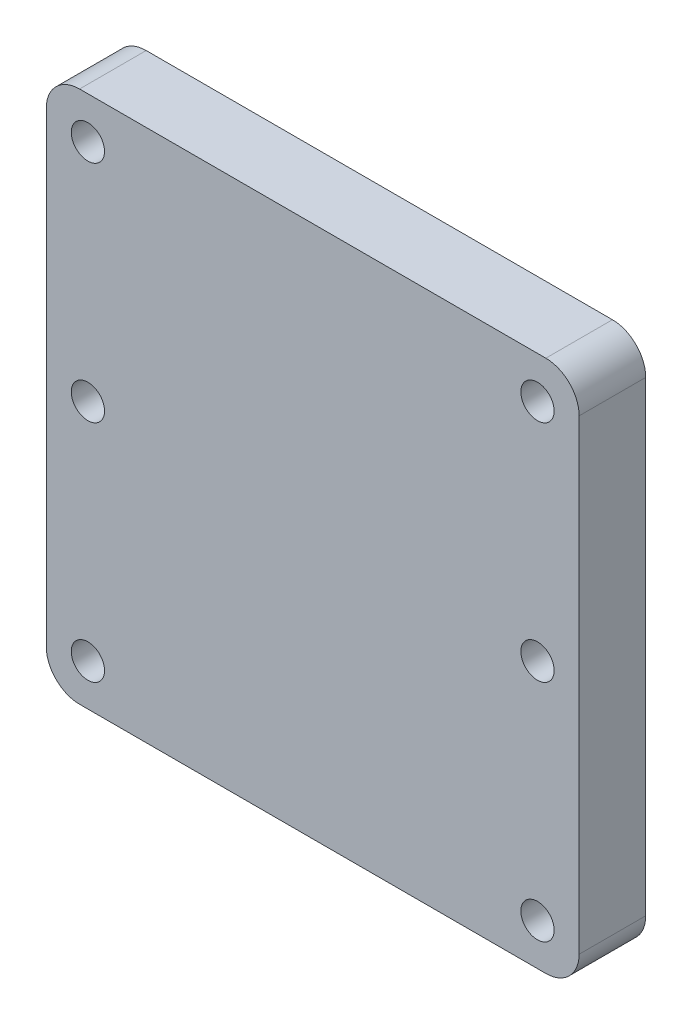
ISO-10303-21;
HEADER;
FILE_DESCRIPTION(('STEP AP214'),'2;1');
FILE_NAME('part.step','',(''),(''),'','','');
FILE_SCHEMA(('AUTOMOTIVE_DESIGN { 1 0 10303 214 1 1 1 1 }'));
ENDSEC;
DATA;
#1=APPLICATION_CONTEXT('core data for automotive mechanical design processes');
#2=APPLICATION_PROTOCOL_DEFINITION('international standard','automotive_design',2000,#1);
#3=PRODUCT_CONTEXT('',#1,'mechanical');
#4=PRODUCT('Part','Part','',(#3));
#5=PRODUCT_RELATED_PRODUCT_CATEGORY('part','',(#4));
#6=PRODUCT_DEFINITION_FORMATION('','',#4);
#7=PRODUCT_DEFINITION_CONTEXT('part definition',#1,'design');
#8=PRODUCT_DEFINITION('design','',#6,#7);
#9=PRODUCT_DEFINITION_SHAPE('','',#8);
#10=(LENGTH_UNIT() NAMED_UNIT(*) SI_UNIT(.MILLI.,.METRE.));
#11=(NAMED_UNIT(*) PLANE_ANGLE_UNIT() SI_UNIT($,.RADIAN.));
#12=(NAMED_UNIT(*) SI_UNIT($,.STERADIAN.) SOLID_ANGLE_UNIT());
#13=UNCERTAINTY_MEASURE_WITH_UNIT(LENGTH_MEASURE(1.E-05),#10,'distance_accuracy_value','');
#14=(GEOMETRIC_REPRESENTATION_CONTEXT(3) GLOBAL_UNCERTAINTY_ASSIGNED_CONTEXT((#13)) GLOBAL_UNIT_ASSIGNED_CONTEXT((#10,
#11,#12)) REPRESENTATION_CONTEXT('',''));
#15=CARTESIAN_POINT('',(0.,0.,0.));
#16=DIRECTION('',(0.,0.,1.));
#17=DIRECTION('',(1.,0.,0.));
#18=AXIS2_PLACEMENT_3D('',#15,#16,#17);
#19=CARTESIAN_POINT('',(-44.45,-44.45,12.7));
#20=DIRECTION('',(0.,0.,-1.));
#21=DIRECTION('',(-1.,0.,0.));
#22=AXIS2_PLACEMENT_3D('',#19,#20,#21);
#23=PLANE('',#22);
#24=CARTESIAN_POINT('',(-44.45,-44.45,12.7));
#25=DIRECTION('',(0.,0.,1.));
#26=DIRECTION('',(-1.,0.,0.));
#27=AXIS2_PLACEMENT_3D('',#24,#25,#26);
#28=CIRCLE('',#27,6.35);
#29=CARTESIAN_POINT('',(-50.8,-44.45,12.7));
#30=VERTEX_POINT('',#29);
#31=CARTESIAN_POINT('',(-44.4499999999999,-50.8,12.7));
#32=VERTEX_POINT('',#31);
#33=EDGE_CURVE('E150',#30,#32,#28,.T.);
#34=ORIENTED_EDGE('',*,*,#33,.T.);
#35=DIRECTION('',(1.,0.,0.));
#36=VECTOR('',#35,1.);
#37=CARTESIAN_POINT('',(44.45,-50.8,12.7));
#38=LINE('',#37,#36);
#39=CARTESIAN_POINT('',(44.45,-50.8,12.7));
#40=VERTEX_POINT('',#39);
#41=EDGE_CURVE('E98',#32,#40,#38,.T.);
#42=ORIENTED_EDGE('',*,*,#41,.T.);
#43=CARTESIAN_POINT('',(44.45,-44.45,12.7));
#44=DIRECTION('',(0.,0.,1.));
#45=DIRECTION('',(1.,0.,0.));
#46=AXIS2_PLACEMENT_3D('',#43,#44,#45);
#47=CIRCLE('',#46,6.35);
#48=CARTESIAN_POINT('',(50.8,-44.45,12.7));
#49=VERTEX_POINT('',#48);
#50=EDGE_CURVE('E165',#40,#49,#47,.T.);
#51=ORIENTED_EDGE('',*,*,#50,.T.);
#52=DIRECTION('',(0.,1.,0.));
#53=VECTOR('',#52,1.);
#54=CARTESIAN_POINT('',(50.8,-44.45,12.7));
#55=LINE('',#54,#53);
#56=CARTESIAN_POINT('',(50.8,44.45,12.7));
#57=VERTEX_POINT('',#56);
#58=EDGE_CURVE('E178',#49,#57,#55,.T.);
#59=ORIENTED_EDGE('',*,*,#58,.T.);
#60=CARTESIAN_POINT('',(44.45,44.45,12.7));
#61=DIRECTION('',(0.,0.,1.));
#62=DIRECTION('',(1.,0.,0.));
#63=AXIS2_PLACEMENT_3D('',#60,#61,#62);
#64=CIRCLE('',#63,6.35);
#65=CARTESIAN_POINT('',(44.45,50.8,12.7));
#66=VERTEX_POINT('',#65);
#67=EDGE_CURVE('E117',#57,#66,#64,.T.);
#68=ORIENTED_EDGE('',*,*,#67,.T.);
#69=DIRECTION('',(-1.,0.,0.));
#70=VECTOR('',#69,1.);
#71=CARTESIAN_POINT('',(44.45,50.8,12.7));
#72=LINE('',#71,#70);
#73=CARTESIAN_POINT('',(-44.4499999999999,50.8,12.7));
#74=VERTEX_POINT('',#73);
#75=EDGE_CURVE('E111',#66,#74,#72,.T.);
#76=ORIENTED_EDGE('',*,*,#75,.T.);
#77=CARTESIAN_POINT('',(-44.45,44.45,12.7));
#78=DIRECTION('',(0.,0.,1.));
#79=DIRECTION('',(1.,0.,0.));
#80=AXIS2_PLACEMENT_3D('',#77,#78,#79);
#81=CIRCLE('',#80,6.35);
#82=CARTESIAN_POINT('',(-50.8,44.45,12.7));
#83=VERTEX_POINT('',#82);
#84=EDGE_CURVE('E115',#74,#83,#81,.T.);
#85=ORIENTED_EDGE('',*,*,#84,.T.);
#86=DIRECTION('',(0.,-1.,0.));
#87=VECTOR('',#86,1.);
#88=CARTESIAN_POINT('',(-50.8,-44.45,12.7));
#89=LINE('',#88,#87);
#90=EDGE_CURVE('E55',#83,#30,#89,.T.);
#91=ORIENTED_EDGE('',*,*,#90,.T.);
#92=EDGE_LOOP('',(#34,#42,#51,#59,#68,#76,#85,#91));
#93=FACE_BOUND('',#92,.T.);
#94=CARTESIAN_POINT('',(-42.8625,42.8625,12.7));
#95=DIRECTION('',(0.,0.,1.));
#96=DIRECTION('',(1.,0.,0.));
#97=AXIS2_PLACEMENT_3D('',#94,#95,#96);
#98=CIRCLE('',#97,3.175);
#99=CARTESIAN_POINT('',(-39.6875,42.8625,12.7));
#100=VERTEX_POINT('',#99);
#101=EDGE_CURVE('E139',#100,#100,#98,.T.);
#102=ORIENTED_EDGE('',*,*,#101,.F.);
#103=EDGE_LOOP('',(#102));
#104=FACE_BOUND('',#103,.T.);
#105=CARTESIAN_POINT('',(42.8625,42.8625,12.7));
#106=DIRECTION('',(0.,0.,1.));
#107=DIRECTION('',(1.,0.,0.));
#108=AXIS2_PLACEMENT_3D('',#105,#106,#107);
#109=CIRCLE('',#108,3.17499999999997);
#110=CARTESIAN_POINT('',(46.0374999999999,42.8625,12.7));
#111=VERTEX_POINT('',#110);
#112=EDGE_CURVE('E187',#111,#111,#109,.T.);
#113=ORIENTED_EDGE('',*,*,#112,.F.);
#114=EDGE_LOOP('',(#113));
#115=FACE_BOUND('',#114,.T.);
#116=CARTESIAN_POINT('',(42.8625,-42.8625,12.7));
#117=DIRECTION('',(0.,0.,1.));
#118=DIRECTION('',(1.,0.,0.));
#119=AXIS2_PLACEMENT_3D('',#116,#117,#118);
#120=CIRCLE('',#119,3.175);
#121=CARTESIAN_POINT('',(46.0375,-42.8625,12.7));
#122=VERTEX_POINT('',#121);
#123=EDGE_CURVE('E193',#122,#122,#120,.T.);
#124=ORIENTED_EDGE('',*,*,#123,.F.);
#125=EDGE_LOOP('',(#124));
#126=FACE_BOUND('',#125,.T.);
#127=CARTESIAN_POINT('',(-42.8625,-42.8625,12.7));
#128=DIRECTION('',(0.,0.,1.));
#129=DIRECTION('',(1.,0.,0.));
#130=AXIS2_PLACEMENT_3D('',#127,#128,#129);
#131=CIRCLE('',#130,3.175);
#132=CARTESIAN_POINT('',(-39.6875,-42.8625,12.7));
#133=VERTEX_POINT('',#132);
#134=EDGE_CURVE('E199',#133,#133,#131,.T.);
#135=ORIENTED_EDGE('',*,*,#134,.F.);
#136=EDGE_LOOP('',(#135));
#137=FACE_BOUND('',#136,.T.);
#138=CARTESIAN_POINT('',(-42.8625,0.,12.7));
#139=DIRECTION('',(0.,0.,1.));
#140=DIRECTION('',(1.,0.,0.));
#141=AXIS2_PLACEMENT_3D('',#138,#139,#140);
#142=CIRCLE('',#141,3.175);
#143=CARTESIAN_POINT('',(-39.6875,0.,12.7));
#144=VERTEX_POINT('',#143);
#145=EDGE_CURVE('E205',#144,#144,#142,.T.);
#146=ORIENTED_EDGE('',*,*,#145,.F.);
#147=EDGE_LOOP('',(#146));
#148=FACE_BOUND('',#147,.T.);
#149=CARTESIAN_POINT('',(42.8625,0.,12.7));
#150=DIRECTION('',(0.,0.,1.));
#151=DIRECTION('',(1.,0.,0.));
#152=AXIS2_PLACEMENT_3D('',#149,#150,#151);
#153=CIRCLE('',#152,3.175);
#154=CARTESIAN_POINT('',(46.0375,0.,12.7));
#155=VERTEX_POINT('',#154);
#156=EDGE_CURVE('E211',#155,#155,#153,.T.);
#157=ORIENTED_EDGE('',*,*,#156,.F.);
#158=EDGE_LOOP('',(#157));
#159=FACE_BOUND('',#158,.T.);
#160=ADVANCED_FACE('F38',(#93,#104,#115,#126,#137,#148,#159),#23,.F.);
#161=CARTESIAN_POINT('',(-44.45,-44.45,0.));
#162=DIRECTION('',(0.,0.,-1.));
#163=DIRECTION('',(-1.,0.,0.));
#164=AXIS2_PLACEMENT_3D('',#161,#162,#163);
#165=PLANE('',#164);
#166=CARTESIAN_POINT('',(-42.8625,0.,0.));
#167=DIRECTION('',(0.,0.,1.));
#168=DIRECTION('',(1.,0.,0.));
#169=AXIS2_PLACEMENT_3D('',#166,#167,#168);
#170=CIRCLE('',#169,3.175);
#171=CARTESIAN_POINT('',(-39.6875,0.,0.));
#172=VERTEX_POINT('',#171);
#173=EDGE_CURVE('E208',#172,#172,#170,.T.);
#174=ORIENTED_EDGE('',*,*,#173,.T.);
#175=EDGE_LOOP('',(#174));
#176=FACE_BOUND('',#175,.T.);
#177=CARTESIAN_POINT('',(42.8625,-42.8625,0.));
#178=DIRECTION('',(0.,0.,1.));
#179=DIRECTION('',(1.,0.,0.));
#180=AXIS2_PLACEMENT_3D('',#177,#178,#179);
#181=CIRCLE('',#180,3.175);
#182=CARTESIAN_POINT('',(46.0375,-42.8625,0.));
#183=VERTEX_POINT('',#182);
#184=EDGE_CURVE('E196',#183,#183,#181,.T.);
#185=ORIENTED_EDGE('',*,*,#184,.T.);
#186=EDGE_LOOP('',(#185));
#187=FACE_BOUND('',#186,.T.);
#188=CARTESIAN_POINT('',(-42.8625,42.8625,0.));
#189=DIRECTION('',(0.,0.,1.));
#190=DIRECTION('',(1.,0.,0.));
#191=AXIS2_PLACEMENT_3D('',#188,#189,#190);
#192=CIRCLE('',#191,3.175);
#193=CARTESIAN_POINT('',(-39.6875,42.8625,0.));
#194=VERTEX_POINT('',#193);
#195=EDGE_CURVE('E184',#194,#194,#192,.T.);
#196=ORIENTED_EDGE('',*,*,#195,.T.);
#197=EDGE_LOOP('',(#196));
#198=FACE_BOUND('',#197,.T.);
#199=CARTESIAN_POINT('',(-44.45,-44.45,0.));
#200=DIRECTION('',(0.,0.,1.));
#201=DIRECTION('',(-1.,0.,0.));
#202=AXIS2_PLACEMENT_3D('',#199,#200,#201);
#203=CIRCLE('',#202,6.35);
#204=CARTESIAN_POINT('',(-50.8,-44.45,0.));
#205=VERTEX_POINT('',#204);
#206=CARTESIAN_POINT('',(-44.4499999999999,-50.8,0.));
#207=VERTEX_POINT('',#206);
#208=EDGE_CURVE('E135',#205,#207,#203,.T.);
#209=ORIENTED_EDGE('',*,*,#208,.F.);
#210=DIRECTION('',(0.,-1.,0.));
#211=VECTOR('',#210,1.);
#212=CARTESIAN_POINT('',(-50.8,-44.45,0.));
#213=LINE('',#212,#211);
#214=CARTESIAN_POINT('',(-50.8,44.45,0.));
#215=VERTEX_POINT('',#214);
#216=EDGE_CURVE('E90',#215,#205,#213,.T.);
#217=ORIENTED_EDGE('',*,*,#216,.F.);
#218=CARTESIAN_POINT('',(-44.45,44.45,0.));
#219=DIRECTION('',(0.,0.,1.));
#220=DIRECTION('',(1.,0.,0.));
#221=AXIS2_PLACEMENT_3D('',#218,#219,#220);
#222=CIRCLE('',#221,6.35);
#223=CARTESIAN_POINT('',(-44.4499999999999,50.8,0.));
#224=VERTEX_POINT('',#223);
#225=EDGE_CURVE('E84',#224,#215,#222,.T.);
#226=ORIENTED_EDGE('',*,*,#225,.F.);
#227=DIRECTION('',(-1.,0.,0.));
#228=VECTOR('',#227,1.);
#229=CARTESIAN_POINT('',(44.45,50.8,0.));
#230=LINE('',#229,#228);
#231=CARTESIAN_POINT('',(44.45,50.8,0.));
#232=VERTEX_POINT('',#231);
#233=EDGE_CURVE('E125',#232,#224,#230,.T.);
#234=ORIENTED_EDGE('',*,*,#233,.F.);
#235=CARTESIAN_POINT('',(44.45,44.45,0.));
#236=DIRECTION('',(0.,0.,1.));
#237=DIRECTION('',(1.,0.,0.));
#238=AXIS2_PLACEMENT_3D('',#235,#236,#237);
#239=CIRCLE('',#238,6.35);
#240=CARTESIAN_POINT('',(50.8,44.45,0.));
#241=VERTEX_POINT('',#240);
#242=EDGE_CURVE('E145',#241,#232,#239,.T.);
#243=ORIENTED_EDGE('',*,*,#242,.F.);
#244=DIRECTION('',(0.,1.,0.));
#245=VECTOR('',#244,1.);
#246=CARTESIAN_POINT('',(50.8,-44.45,0.));
#247=LINE('',#246,#245);
#248=CARTESIAN_POINT('',(50.8,-44.45,0.));
#249=VERTEX_POINT('',#248);
#250=EDGE_CURVE('E143',#249,#241,#247,.T.);
#251=ORIENTED_EDGE('',*,*,#250,.F.);
#252=CARTESIAN_POINT('',(44.45,-44.45,0.));
#253=DIRECTION('',(0.,0.,1.));
#254=DIRECTION('',(1.,0.,0.));
#255=AXIS2_PLACEMENT_3D('',#252,#253,#254);
#256=CIRCLE('',#255,6.35);
#257=CARTESIAN_POINT('',(44.45,-50.8,0.));
#258=VERTEX_POINT('',#257);
#259=EDGE_CURVE('E141',#258,#249,#256,.T.);
#260=ORIENTED_EDGE('',*,*,#259,.F.);
#261=DIRECTION('',(1.,0.,0.));
#262=VECTOR('',#261,1.);
#263=CARTESIAN_POINT('',(44.45,-50.8,0.));
#264=LINE('',#263,#262);
#265=EDGE_CURVE('E138',#207,#258,#264,.T.);
#266=ORIENTED_EDGE('',*,*,#265,.F.);
#267=EDGE_LOOP('',(#209,#217,#226,#234,#243,#251,#260,#266));
#268=FACE_BOUND('',#267,.T.);
#269=CARTESIAN_POINT('',(42.8625,42.8625,0.));
#270=DIRECTION('',(0.,0.,1.));
#271=DIRECTION('',(1.,0.,0.));
#272=AXIS2_PLACEMENT_3D('',#269,#270,#271);
#273=CIRCLE('',#272,3.17499999999997);
#274=CARTESIAN_POINT('',(46.0374999999999,42.8625,0.));
#275=VERTEX_POINT('',#274);
#276=EDGE_CURVE('E190',#275,#275,#273,.T.);
#277=ORIENTED_EDGE('',*,*,#276,.T.);
#278=EDGE_LOOP('',(#277));
#279=FACE_BOUND('',#278,.T.);
#280=CARTESIAN_POINT('',(-42.8625,-42.8625,0.));
#281=DIRECTION('',(0.,0.,1.));
#282=DIRECTION('',(1.,0.,0.));
#283=AXIS2_PLACEMENT_3D('',#280,#281,#282);
#284=CIRCLE('',#283,3.175);
#285=CARTESIAN_POINT('',(-39.6875,-42.8625,0.));
#286=VERTEX_POINT('',#285);
#287=EDGE_CURVE('E202',#286,#286,#284,.T.);
#288=ORIENTED_EDGE('',*,*,#287,.T.);
#289=EDGE_LOOP('',(#288));
#290=FACE_BOUND('',#289,.T.);
#291=CARTESIAN_POINT('',(42.8625,0.,0.));
#292=DIRECTION('',(0.,0.,1.));
#293=DIRECTION('',(1.,0.,0.));
#294=AXIS2_PLACEMENT_3D('',#291,#292,#293);
#295=CIRCLE('',#294,3.175);
#296=CARTESIAN_POINT('',(46.0375,0.,0.));
#297=VERTEX_POINT('',#296);
#298=EDGE_CURVE('E214',#297,#297,#295,.T.);
#299=ORIENTED_EDGE('',*,*,#298,.T.);
#300=EDGE_LOOP('',(#299));
#301=FACE_BOUND('',#300,.T.);
#302=ADVANCED_FACE('F169',(#176,#187,#198,#268,#279,#290,#301),#165,.T.);
#303=CARTESIAN_POINT('',(-44.45,-44.45,12.7));
#304=DIRECTION('',(0.,0.,-1.));
#305=DIRECTION('',(-1.,0.,0.));
#306=AXIS2_PLACEMENT_3D('',#303,#304,#305);
#307=CYLINDRICAL_SURFACE('',#306,6.35);
#308=ORIENTED_EDGE('',*,*,#208,.T.);
#309=DIRECTION('',(0.,0.,-1.));
#310=VECTOR('',#309,1.);
#311=CARTESIAN_POINT('',(-44.4499999999999,-50.8,12.7));
#312=LINE('',#311,#310);
#313=EDGE_CURVE('E11',#32,#207,#312,.T.);
#314=ORIENTED_EDGE('',*,*,#313,.F.);
#315=ORIENTED_EDGE('',*,*,#33,.F.);
#316=DIRECTION('',(0.,0.,-1.));
#317=VECTOR('',#316,1.);
#318=CARTESIAN_POINT('',(-50.8,-44.45,12.7));
#319=LINE('',#318,#317);
#320=EDGE_CURVE('E131',#30,#205,#319,.T.);
#321=ORIENTED_EDGE('',*,*,#320,.T.);
#322=EDGE_LOOP('',(#308,#314,#315,#321));
#323=FACE_BOUND('',#322,.T.);
#324=ADVANCED_FACE('F40',(#323),#307,.T.);
#325=CARTESIAN_POINT('',(44.45,-50.8,12.7));
#326=DIRECTION('',(0.,1.,0.));
#327=DIRECTION('',(0.,0.,1.));
#328=AXIS2_PLACEMENT_3D('',#325,#326,#327);
#329=PLANE('',#328);
#330=ORIENTED_EDGE('',*,*,#265,.T.);
#331=DIRECTION('',(0.,0.,-1.));
#332=VECTOR('',#331,1.);
#333=CARTESIAN_POINT('',(44.45,-50.8,12.7));
#334=LINE('',#333,#332);
#335=EDGE_CURVE('E47',#40,#258,#334,.T.);
#336=ORIENTED_EDGE('',*,*,#335,.F.);
#337=ORIENTED_EDGE('',*,*,#41,.F.);
#338=ORIENTED_EDGE('',*,*,#313,.T.);
#339=EDGE_LOOP('',(#330,#336,#337,#338));
#340=FACE_BOUND('',#339,.T.);
#341=ADVANCED_FACE('F246',(#340),#329,.F.);
#342=CARTESIAN_POINT('',(44.45,-44.45,12.7));
#343=DIRECTION('',(0.,0.,-1.));
#344=DIRECTION('',(-1.,0.,0.));
#345=AXIS2_PLACEMENT_3D('',#342,#343,#344);
#346=CYLINDRICAL_SURFACE('',#345,6.35);
#347=ORIENTED_EDGE('',*,*,#259,.T.);
#348=DIRECTION('',(0.,0.,-1.));
#349=VECTOR('',#348,1.);
#350=CARTESIAN_POINT('',(50.8,-44.45,12.7));
#351=LINE('',#350,#349);
#352=EDGE_CURVE('E157',#49,#249,#351,.T.);
#353=ORIENTED_EDGE('',*,*,#352,.F.);
#354=ORIENTED_EDGE('',*,*,#50,.F.);
#355=ORIENTED_EDGE('',*,*,#335,.T.);
#356=EDGE_LOOP('',(#347,#353,#354,#355));
#357=FACE_BOUND('',#356,.T.);
#358=ADVANCED_FACE('F163',(#357),#346,.T.);
#359=CARTESIAN_POINT('',(50.8,-44.45,12.7));
#360=DIRECTION('',(-1.,0.,0.));
#361=DIRECTION('',(0.,0.,1.));
#362=AXIS2_PLACEMENT_3D('',#359,#360,#361);
#363=PLANE('',#362);
#364=ORIENTED_EDGE('',*,*,#250,.T.);
#365=DIRECTION('',(0.,0.,-1.));
#366=VECTOR('',#365,1.);
#367=CARTESIAN_POINT('',(50.8,44.45,12.7));
#368=LINE('',#367,#366);
#369=EDGE_CURVE('E154',#57,#241,#368,.T.);
#370=ORIENTED_EDGE('',*,*,#369,.F.);
#371=ORIENTED_EDGE('',*,*,#58,.F.);
#372=ORIENTED_EDGE('',*,*,#352,.T.);
#373=EDGE_LOOP('',(#364,#370,#371,#372));
#374=FACE_BOUND('',#373,.T.);
#375=ADVANCED_FACE('F174',(#374),#363,.F.);
#376=CARTESIAN_POINT('',(44.45,44.45,12.7));
#377=DIRECTION('',(0.,0.,-1.));
#378=DIRECTION('',(-1.,0.,0.));
#379=AXIS2_PLACEMENT_3D('',#376,#377,#378);
#380=CYLINDRICAL_SURFACE('',#379,6.35);
#381=ORIENTED_EDGE('',*,*,#242,.T.);
#382=DIRECTION('',(0.,0.,-1.));
#383=VECTOR('',#382,1.);
#384=CARTESIAN_POINT('',(44.45,50.8,12.7));
#385=LINE('',#384,#383);
#386=EDGE_CURVE('E126',#66,#232,#385,.T.);
#387=ORIENTED_EDGE('',*,*,#386,.F.);
#388=ORIENTED_EDGE('',*,*,#67,.F.);
#389=ORIENTED_EDGE('',*,*,#369,.T.);
#390=EDGE_LOOP('',(#381,#387,#388,#389));
#391=FACE_BOUND('',#390,.T.);
#392=ADVANCED_FACE('F177',(#391),#380,.T.);
#393=CARTESIAN_POINT('',(44.45,50.8,12.7));
#394=DIRECTION('',(0.,-1.,0.));
#395=DIRECTION('',(0.,0.,-1.));
#396=AXIS2_PLACEMENT_3D('',#393,#394,#395);
#397=PLANE('',#396);
#398=ORIENTED_EDGE('',*,*,#233,.T.);
#399=DIRECTION('',(0.,0.,-1.));
#400=VECTOR('',#399,1.);
#401=CARTESIAN_POINT('',(-44.4499999999999,50.8,12.7));
#402=LINE('',#401,#400);
#403=EDGE_CURVE('E122',#74,#224,#402,.T.);
#404=ORIENTED_EDGE('',*,*,#403,.F.);
#405=ORIENTED_EDGE('',*,*,#75,.F.);
#406=ORIENTED_EDGE('',*,*,#386,.T.);
#407=EDGE_LOOP('',(#398,#404,#405,#406));
#408=FACE_BOUND('',#407,.T.);
#409=ADVANCED_FACE('F123',(#408),#397,.F.);
#410=CARTESIAN_POINT('',(-44.45,44.45,12.7));
#411=DIRECTION('',(0.,0.,-1.));
#412=DIRECTION('',(-1.,0.,0.));
#413=AXIS2_PLACEMENT_3D('',#410,#411,#412);
#414=CYLINDRICAL_SURFACE('',#413,6.35);
#415=ORIENTED_EDGE('',*,*,#225,.T.);
#416=DIRECTION('',(0.,0.,-1.));
#417=VECTOR('',#416,1.);
#418=CARTESIAN_POINT('',(-50.8,44.45,12.7));
#419=LINE('',#418,#417);
#420=EDGE_CURVE('E127',#83,#215,#419,.T.);
#421=ORIENTED_EDGE('',*,*,#420,.F.);
#422=ORIENTED_EDGE('',*,*,#84,.F.);
#423=ORIENTED_EDGE('',*,*,#403,.T.);
#424=EDGE_LOOP('',(#415,#421,#422,#423));
#425=FACE_BOUND('',#424,.T.);
#426=ADVANCED_FACE('F129',(#425),#414,.T.);
#427=CARTESIAN_POINT('',(-50.8,-44.45,12.7));
#428=DIRECTION('',(1.,0.,0.));
#429=DIRECTION('',(0.,0.,-1.));
#430=AXIS2_PLACEMENT_3D('',#427,#428,#429);
#431=PLANE('',#430);
#432=ORIENTED_EDGE('',*,*,#216,.T.);
#433=ORIENTED_EDGE('',*,*,#320,.F.);
#434=ORIENTED_EDGE('',*,*,#90,.F.);
#435=ORIENTED_EDGE('',*,*,#420,.T.);
#436=EDGE_LOOP('',(#432,#433,#434,#435));
#437=FACE_BOUND('',#436,.T.);
#438=ADVANCED_FACE('F234',(#437),#431,.F.);
#439=CARTESIAN_POINT('',(-42.8625,42.8625,12.7));
#440=DIRECTION('',(0.,0.,-1.));
#441=DIRECTION('',(-1.,0.,0.));
#442=AXIS2_PLACEMENT_3D('',#439,#440,#441);
#443=CYLINDRICAL_SURFACE('',#442,3.175);
#444=ORIENTED_EDGE('',*,*,#101,.T.);
#445=EDGE_LOOP('',(#444));
#446=FACE_BOUND('',#445,.T.);
#447=ORIENTED_EDGE('',*,*,#195,.F.);
#448=EDGE_LOOP('',(#447));
#449=FACE_BOUND('',#448,.T.);
#450=ADVANCED_FACE('F231',(#446,#449),#443,.F.);
#451=CARTESIAN_POINT('',(42.8625,42.8625,12.7));
#452=DIRECTION('',(0.,0.,-1.));
#453=DIRECTION('',(-1.,0.,0.));
#454=AXIS2_PLACEMENT_3D('',#451,#452,#453);
#455=CYLINDRICAL_SURFACE('',#454,3.17499999999997);
#456=ORIENTED_EDGE('',*,*,#112,.T.);
#457=EDGE_LOOP('',(#456));
#458=FACE_BOUND('',#457,.T.);
#459=ORIENTED_EDGE('',*,*,#276,.F.);
#460=EDGE_LOOP('',(#459));
#461=FACE_BOUND('',#460,.T.);
#462=ADVANCED_FACE('F309',(#458,#461),#455,.F.);
#463=CARTESIAN_POINT('',(42.8625,-42.8625,12.7));
#464=DIRECTION('',(0.,0.,-1.));
#465=DIRECTION('',(-1.,0.,0.));
#466=AXIS2_PLACEMENT_3D('',#463,#464,#465);
#467=CYLINDRICAL_SURFACE('',#466,3.175);
#468=ORIENTED_EDGE('',*,*,#123,.T.);
#469=EDGE_LOOP('',(#468));
#470=FACE_BOUND('',#469,.T.);
#471=ORIENTED_EDGE('',*,*,#184,.F.);
#472=EDGE_LOOP('',(#471));
#473=FACE_BOUND('',#472,.T.);
#474=ADVANCED_FACE('F317',(#470,#473),#467,.F.);
#475=CARTESIAN_POINT('',(-42.8625,-42.8625,12.7));
#476=DIRECTION('',(0.,0.,-1.));
#477=DIRECTION('',(-1.,0.,0.));
#478=AXIS2_PLACEMENT_3D('',#475,#476,#477);
#479=CYLINDRICAL_SURFACE('',#478,3.175);
#480=ORIENTED_EDGE('',*,*,#134,.T.);
#481=EDGE_LOOP('',(#480));
#482=FACE_BOUND('',#481,.T.);
#483=ORIENTED_EDGE('',*,*,#287,.F.);
#484=EDGE_LOOP('',(#483));
#485=FACE_BOUND('',#484,.T.);
#486=ADVANCED_FACE('F325',(#482,#485),#479,.F.);
#487=CARTESIAN_POINT('',(-42.8625,0.,12.7));
#488=DIRECTION('',(0.,0.,-1.));
#489=DIRECTION('',(-1.,0.,0.));
#490=AXIS2_PLACEMENT_3D('',#487,#488,#489);
#491=CYLINDRICAL_SURFACE('',#490,3.175);
#492=ORIENTED_EDGE('',*,*,#145,.T.);
#493=EDGE_LOOP('',(#492));
#494=FACE_BOUND('',#493,.T.);
#495=ORIENTED_EDGE('',*,*,#173,.F.);
#496=EDGE_LOOP('',(#495));
#497=FACE_BOUND('',#496,.T.);
#498=ADVANCED_FACE('F334',(#494,#497),#491,.F.);
#499=CARTESIAN_POINT('',(42.8625,0.,12.7));
#500=DIRECTION('',(0.,0.,-1.));
#501=DIRECTION('',(-1.,0.,0.));
#502=AXIS2_PLACEMENT_3D('',#499,#500,#501);
#503=CYLINDRICAL_SURFACE('',#502,3.175);
#504=ORIENTED_EDGE('',*,*,#156,.T.);
#505=EDGE_LOOP('',(#504));
#506=FACE_BOUND('',#505,.T.);
#507=ORIENTED_EDGE('',*,*,#298,.F.);
#508=EDGE_LOOP('',(#507));
#509=FACE_BOUND('',#508,.T.);
#510=ADVANCED_FACE('F220',(#506,#509),#503,.F.);
#511=CLOSED_SHELL('',(#160,#302,#324,#341,#358,#375,#392,#409,#426,#438,#450,#462,#474,#486,
#498,#510));
#512=MANIFOLD_SOLID_BREP('B2',#511);
#513=ADVANCED_BREP_SHAPE_REPRESENTATION('',(#18,#512),#14);
#514=SHAPE_DEFINITION_REPRESENTATION(#9,#513);
ENDSEC;
END-ISO-10303-21;
